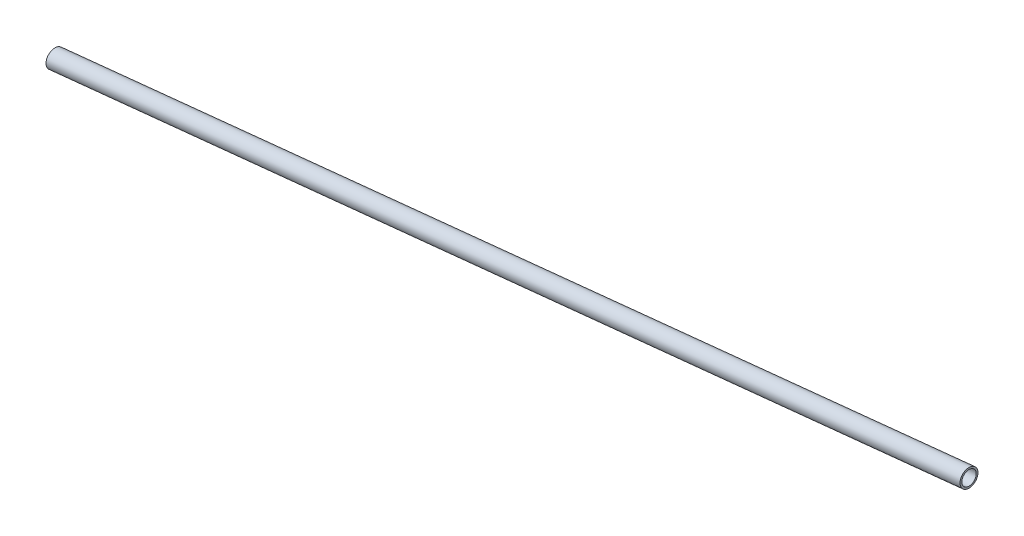
ISO-10303-21;
HEADER;
FILE_DESCRIPTION(('STEP AP214'),'2;1');
FILE_NAME('part.step','',(''),(''),'','','');
FILE_SCHEMA(('AUTOMOTIVE_DESIGN { 1 0 10303 214 1 1 1 1 }'));
ENDSEC;
DATA;
#1=APPLICATION_CONTEXT('core data for automotive mechanical design processes');
#2=APPLICATION_PROTOCOL_DEFINITION('international standard','automotive_design',2000,#1);
#3=PRODUCT_CONTEXT('',#1,'mechanical');
#4=PRODUCT('Part','Part','',(#3));
#5=PRODUCT_RELATED_PRODUCT_CATEGORY('part','',(#4));
#6=PRODUCT_DEFINITION_FORMATION('','',#4);
#7=PRODUCT_DEFINITION_CONTEXT('part definition',#1,'design');
#8=PRODUCT_DEFINITION('design','',#6,#7);
#9=PRODUCT_DEFINITION_SHAPE('','',#8);
#10=(LENGTH_UNIT() NAMED_UNIT(*) SI_UNIT(.MILLI.,.METRE.));
#11=(NAMED_UNIT(*) PLANE_ANGLE_UNIT() SI_UNIT($,.RADIAN.));
#12=(NAMED_UNIT(*) SI_UNIT($,.STERADIAN.) SOLID_ANGLE_UNIT());
#13=UNCERTAINTY_MEASURE_WITH_UNIT(LENGTH_MEASURE(1.E-05),#10,'distance_accuracy_value','');
#14=(GEOMETRIC_REPRESENTATION_CONTEXT(3) GLOBAL_UNCERTAINTY_ASSIGNED_CONTEXT((#13)) GLOBAL_UNIT_ASSIGNED_CONTEXT((#10,
#11,#12)) REPRESENTATION_CONTEXT('',''));
#15=CARTESIAN_POINT('',(0.,0.,0.));
#16=DIRECTION('',(0.,0.,1.));
#17=DIRECTION('',(1.,0.,0.));
#18=AXIS2_PLACEMENT_3D('',#15,#16,#17);
#19=CARTESIAN_POINT('',(900.,-13.3527483768346,-117.528566468452));
#20=DIRECTION('',(1.,0.,0.));
#21=DIRECTION('',(0.,0.,-1.));
#22=AXIS2_PLACEMENT_3D('',#19,#20,#21);
#23=PLANE('',#22);
#24=CARTESIAN_POINT('',(900.,-13.3527483768346,-117.528566468452));
#25=DIRECTION('',(1.,0.,0.));
#26=DIRECTION('',(0.,0.,-1.));
#27=AXIS2_PLACEMENT_3D('',#24,#25,#26);
#28=CIRCLE('',#27,7.99999999999999);
#29=CARTESIAN_POINT('',(900.,-13.6611981228931,-125.522617929017));
#30=VERTEX_POINT('',#29);
#31=EDGE_CURVE('E76',#30,#30,#28,.T.);
#32=ORIENTED_EDGE('',*,*,#31,.F.);
#33=EDGE_LOOP('',(#32));
#34=FACE_BOUND('',#33,.T.);
#35=CARTESIAN_POINT('',(900.,-13.3527483768346,-117.528566468452));
#36=DIRECTION('',(1.,0.,0.));
#37=DIRECTION('',(0.,0.,-1.));
#38=AXIS2_PLACEMENT_3D('',#35,#36,#37);
#39=CIRCLE('',#38,9.99999999999999);
#40=CARTESIAN_POINT('',(900.,-13.3527483768346,-127.528566468452));
#41=VERTEX_POINT('',#40);
#42=EDGE_CURVE('E11',#41,#41,#39,.T.);
#43=ORIENTED_EDGE('',*,*,#42,.T.);
#44=EDGE_LOOP('',(#43));
#45=FACE_BOUND('',#44,.T.);
#46=ADVANCED_FACE('F61',(#34,#45),#23,.T.);
#47=CARTESIAN_POINT('',(0.,0.,0.));
#48=DIRECTION('',(1.,0.,0.));
#49=DIRECTION('',(0.,0.,-1.));
#50=AXIS2_PLACEMENT_3D('',#47,#48,#49);
#51=PLANE('',#50);
#52=CARTESIAN_POINT('',(0.,0.,0.));
#53=DIRECTION('',(-1.,0.,0.));
#54=DIRECTION('',(0.,0.,1.));
#55=AXIS2_PLACEMENT_3D('',#52,#53,#54);
#56=CIRCLE('',#55,8.);
#57=CARTESIAN_POINT('',(0.,0.04684620258965,-7.9998628384056));
#58=VERTEX_POINT('',#57);
#59=EDGE_CURVE('E88',#58,#58,#56,.T.);
#60=ORIENTED_EDGE('',*,*,#59,.F.);
#61=EDGE_LOOP('',(#60));
#62=FACE_BOUND('',#61,.T.);
#63=CARTESIAN_POINT('',(0.,0.,0.));
#64=DIRECTION('',(1.,0.,0.));
#65=DIRECTION('',(0.,0.,-1.));
#66=AXIS2_PLACEMENT_3D('',#63,#64,#65);
#67=CIRCLE('',#66,10.);
#68=CARTESIAN_POINT('',(0.,0.,-10.));
#69=VERTEX_POINT('',#68);
#70=EDGE_CURVE('E70',#69,#69,#67,.T.);
#71=ORIENTED_EDGE('',*,*,#70,.F.);
#72=EDGE_LOOP('',(#71));
#73=FACE_BOUND('',#72,.T.);
#74=ADVANCED_FACE('F93',(#62,#73),#51,.F.);
#75=CARTESIAN_POINT('',(0.,0.,-10.));
#76=CARTESIAN_POINT('',(900.,-13.3527483768346,-127.528566468452));
#77=CARTESIAN_POINT('',(0.,0.416666666666666,-10.));
#78=CARTESIAN_POINT('',(900.,-12.9360817101679,-127.528566468452));
#79=CARTESIAN_POINT('',(0.,0.859634009449971,-9.97415615944867));
#80=CARTESIAN_POINT('',(900.,-12.4931143673846,-127.502722627901));
#81=CARTESIAN_POINT('',(0.,1.7952332471872,-9.84885269010886));
#82=CARTESIAN_POINT('',(900.,-11.5575151296474,-127.377419158561));
#83=CARTESIAN_POINT('',(0.,2.288,-9.74933333333333));
#84=CARTESIAN_POINT('',(900.000000000001,-11.0647483768346,-127.277899801786));
#85=CARTESIAN_POINT('',(0.,3.312,-9.45066666666667));
#86=CARTESIAN_POINT('',(900.,-10.0407483768346,-126.979233135119));
#87=CARTESIAN_POINT('',(0.,3.84336994487228,-9.25135715187476));
#88=CARTESIAN_POINT('',(900.,-9.5093784319623,-126.779923620327));
#89=CARTESIAN_POINT('',(0.,4.92067499894794,-8.72617093801288));
#90=CARTESIAN_POINT('',(900.,-8.43207337788663,-126.254737406465));
#91=CARTESIAN_POINT('',(0.,5.46666666666667,-8.4));
#92=CARTESIAN_POINT('',(900.,-7.88608171016791,-125.928566468452));
#93=CARTESIAN_POINT('',(0.,6.53333333333333,-7.6));
#94=CARTESIAN_POINT('',(900.,-6.81941504350124,-125.128566468452));
#95=CARTESIAN_POINT('',(0.,7.05385625820979,-7.12578970413461));
#96=CARTESIAN_POINT('',(900.,-6.29889211862478,-124.654356172587));
#97=CARTESIAN_POINT('',(0.,8.01463689247513,-6.02489522737224));
#98=CARTESIAN_POINT('',(900.,-5.33811148435944,-123.553461695825));
#99=CARTESIAN_POINT('',(0.,8.45444059976932,-5.39792387543253));
#100=CARTESIAN_POINT('',(900.,-4.89830777706526,-122.926490343885));
#101=CARTESIAN_POINT('',(0.,9.19261822376009,-4.01384083044983));
#102=CARTESIAN_POINT('',(900.,-4.16013015307449,-121.542407298902));
#103=CARTESIAN_POINT('',(0.,9.49033530571992,-3.25680473372781));
#104=CARTESIAN_POINT('',(900.,-3.86241307111466,-120.78537120218));
#105=CARTESIAN_POINT('',(0.,9.89428007889546,-1.66627218934911));
#106=CARTESIAN_POINT('',(900.,-3.45846829793912,-119.194838657801));
#107=CARTESIAN_POINT('',(0.,10.,-0.833333333333337));
#108=CARTESIAN_POINT('',(900.,-3.35274837683458,-118.361899801786));
#109=CARTESIAN_POINT('',(0.,9.99999999999999,0.833333333333334));
#110=CARTESIAN_POINT('',(900.,-3.35274837683458,-116.695233135119));
#111=CARTESIAN_POINT('',(0.,9.89428007889547,1.66627218934911));
#112=CARTESIAN_POINT('',(900.,-3.45846829793911,-115.862294279103));
#113=CARTESIAN_POINT('',(0.,9.49033530571992,3.25680473372781));
#114=CARTESIAN_POINT('',(900.,-3.86241307111466,-114.271761734725));
#115=CARTESIAN_POINT('',(0.,9.19261822376009,4.01384083044983));
#116=CARTESIAN_POINT('',(900.,-4.16013015307449,-113.514725638003));
#117=CARTESIAN_POINT('',(0.,8.45444059976932,5.39792387543252));
#118=CARTESIAN_POINT('',(900.,-4.89830777706526,-112.13064259302));
#119=CARTESIAN_POINT('',(0.,8.01463689247513,6.02489522737224));
#120=CARTESIAN_POINT('',(900.,-5.33811148435944,-111.50367124108));
#121=CARTESIAN_POINT('',(0.,7.0538562582098,7.12578970413461));
#122=CARTESIAN_POINT('',(900.,-6.29889211862478,-110.402776764318));
#123=CARTESIAN_POINT('',(0.,6.53333333333334,7.6));
#124=CARTESIAN_POINT('',(900.,-6.81941504350124,-109.928566468452));
#125=CARTESIAN_POINT('',(0.,5.46666666666667,8.4));
#126=CARTESIAN_POINT('',(900.,-7.88608171016791,-109.128566468452));
#127=CARTESIAN_POINT('',(0.,4.92067499894794,8.72617093801288));
#128=CARTESIAN_POINT('',(900.,-8.43207337788663,-108.802395530439));
#129=CARTESIAN_POINT('',(0.,3.84336994487228,9.25135715187476));
#130=CARTESIAN_POINT('',(900.,-9.50937843196229,-108.277209316578));
#131=CARTESIAN_POINT('',(0.,3.312,9.45066666666667));
#132=CARTESIAN_POINT('',(900.,-10.0407483768346,-108.077899801786));
#133=CARTESIAN_POINT('',(0.,2.288,9.74933333333334));
#134=CARTESIAN_POINT('',(900.,-11.0647483768346,-107.779233135119));
#135=CARTESIAN_POINT('',(0.,1.7952332471872,9.84885269010886));
#136=CARTESIAN_POINT('',(900.,-11.5575151296474,-107.679713778343));
#137=CARTESIAN_POINT('',(0.,0.859634009449971,9.97415615944867));
#138=CARTESIAN_POINT('',(900.,-12.4931143673846,-107.554410309004));
#139=CARTESIAN_POINT('',(0.,0.416666666666668,10.));
#140=CARTESIAN_POINT('',(900.,-12.9360817101679,-107.528566468452));
#141=CARTESIAN_POINT('',(0.,-0.416666666666665,10.));
#142=CARTESIAN_POINT('',(900.000000000001,-13.7694150435012,-107.528566468452));
#143=CARTESIAN_POINT('',(0.,-0.859634009449969,9.97415615944867));
#144=CARTESIAN_POINT('',(900.,-14.2123823862845,-107.554410309004));
#145=CARTESIAN_POINT('',(0.,-1.7952332471872,9.84885269010886));
#146=CARTESIAN_POINT('',(900.,-15.1479816240218,-107.679713778343));
#147=CARTESIAN_POINT('',(0.,-2.288,9.74933333333334));
#148=CARTESIAN_POINT('',(900.,-15.6407483768346,-107.779233135119));
#149=CARTESIAN_POINT('',(0.,-3.312,9.45066666666667));
#150=CARTESIAN_POINT('',(900.,-16.6647483768346,-108.077899801786));
#151=CARTESIAN_POINT('',(0.,-3.84336994487228,9.25135715187477));
#152=CARTESIAN_POINT('',(900.,-17.1961183217068,-108.277209316578));
#153=CARTESIAN_POINT('',(0.,-4.92067499894794,8.72617093801288));
#154=CARTESIAN_POINT('',(900.,-18.2734233757825,-108.802395530439));
#155=CARTESIAN_POINT('',(0.,-5.46666666666667,8.4));
#156=CARTESIAN_POINT('',(900.,-18.8194150435012,-109.128566468452));
#157=CARTESIAN_POINT('',(0.,-6.53333333333333,7.6));
#158=CARTESIAN_POINT('',(900.,-19.8860817101679,-109.928566468452));
#159=CARTESIAN_POINT('',(0.,-7.05385625820979,7.12578970413462));
#160=CARTESIAN_POINT('',(900.,-20.4066046350444,-110.402776764318));
#161=CARTESIAN_POINT('',(0.,-8.01463689247514,6.02489522737224));
#162=CARTESIAN_POINT('',(900.,-21.3673852693097,-111.50367124108));
#163=CARTESIAN_POINT('',(0.,-8.45444059976932,5.39792387543253));
#164=CARTESIAN_POINT('',(900.,-21.8071889766039,-112.13064259302));
#165=CARTESIAN_POINT('',(0.,-9.19261822376009,4.01384083044983));
#166=CARTESIAN_POINT('',(900.,-22.5453666005947,-113.514725638002));
#167=CARTESIAN_POINT('',(0.,-9.49033530571992,3.25680473372781));
#168=CARTESIAN_POINT('',(900.,-22.8430836825545,-114.271761734724));
#169=CARTESIAN_POINT('',(0.,-9.89428007889546,1.66627218934911));
#170=CARTESIAN_POINT('',(900.,-23.24702845573,-115.862294279103));
#171=CARTESIAN_POINT('',(0.,-10.,0.833333333333333));
#172=CARTESIAN_POINT('',(900.,-23.3527483768346,-116.695233135119));
#173=CARTESIAN_POINT('',(0.,-10.,-0.833333333333334));
#174=CARTESIAN_POINT('',(900.,-23.3527483768346,-118.361899801786));
#175=CARTESIAN_POINT('',(0.,-9.89428007889547,-1.66627218934911));
#176=CARTESIAN_POINT('',(900.,-23.24702845573,-119.194838657801));
#177=CARTESIAN_POINT('',(0.,-9.49033530571992,-3.25680473372781));
#178=CARTESIAN_POINT('',(900.,-22.8430836825545,-120.78537120218));
#179=CARTESIAN_POINT('',(0.,-9.19261822376009,-4.01384083044983));
#180=CARTESIAN_POINT('',(900.,-22.5453666005947,-121.542407298902));
#181=CARTESIAN_POINT('',(0.,-8.45444059976932,-5.39792387543252));
#182=CARTESIAN_POINT('',(900.,-21.8071889766039,-122.926490343885));
#183=CARTESIAN_POINT('',(0.,-8.01463689247514,-6.02489522737224));
#184=CARTESIAN_POINT('',(900.,-21.3673852693097,-123.553461695825));
#185=CARTESIAN_POINT('',(0.,-7.05385625820979,-7.12578970413461));
#186=CARTESIAN_POINT('',(900.,-20.4066046350444,-124.654356172587));
#187=CARTESIAN_POINT('',(0.,-6.53333333333333,-7.6));
#188=CARTESIAN_POINT('',(900.,-19.8860817101679,-125.128566468452));
#189=CARTESIAN_POINT('',(0.,-5.46666666666667,-8.4));
#190=CARTESIAN_POINT('',(900.,-18.8194150435012,-125.928566468452));
#191=CARTESIAN_POINT('',(0.,-4.92067499894794,-8.72617093801288));
#192=CARTESIAN_POINT('',(900.,-18.2734233757825,-126.254737406465));
#193=CARTESIAN_POINT('',(0.,-3.84336994487228,-9.25135715187476));
#194=CARTESIAN_POINT('',(900.,-17.1961183217069,-126.779923620327));
#195=CARTESIAN_POINT('',(0.,-3.312,-9.45066666666666));
#196=CARTESIAN_POINT('',(900.000000000001,-16.6647483768346,-126.979233135119));
#197=CARTESIAN_POINT('',(0.,-2.288,-9.74933333333334));
#198=CARTESIAN_POINT('',(900.,-15.6407483768346,-127.277899801786));
#199=CARTESIAN_POINT('',(0.,-1.7952332471872,-9.84885269010886));
#200=CARTESIAN_POINT('',(900.,-15.1479816240218,-127.377419158561));
#201=CARTESIAN_POINT('',(0.,-0.85963400944997,-9.97415615944867));
#202=CARTESIAN_POINT('',(900.,-14.2123823862845,-127.502722627901));
#203=CARTESIAN_POINT('',(0.,-0.416666666666666,-10.));
#204=CARTESIAN_POINT('',(900.,-13.7694150435012,-127.528566468452));
#205=CARTESIAN_POINT('',(0.,0.,-10.));
#206=CARTESIAN_POINT('',(900.,-13.3527483768346,-127.528566468452));
#207=B_SPLINE_SURFACE_WITH_KNOTS('',3,1,((#75,#76),(#77,#78),(#79,#80),(#81,#82),(#83,#84),(#85,
#86),(#87,#88),(#89,#90),(#91,#92),(#93,#94),(#95,#96),(#97,#98),(#99,#100),(#101,#102),(#103,
#104),(#105,#106),(#107,#108),(#109,#110),(#111,#112),(#113,#114),(#115,#116),(#117,#118),(#119,
#120),(#121,#122),(#123,#124),(#125,#126),(#127,#128),(#129,#130),(#131,#132),(#133,#134),(#135,
#136),(#137,#138),(#139,#140),(#141,#142),(#143,#144),(#145,#146),(#147,#148),(#149,#150),(#151,
#152),(#153,#154),(#155,#156),(#157,#158),(#159,#160),(#161,#162),(#163,#164),(#165,#166),(#167,
#168),(#169,#170),(#171,#172),(#173,#174),(#175,#176),(#177,#178),(#179,#180),(#181,#182),(#183,
#184),(#185,#186),(#187,#188),(#189,#190),(#191,#192),(#193,#194),(#195,#196),(#197,#198),(#199,
#200),(#201,#202),(#203,#204),(#205,#206)),.UNSPECIFIED.,.T.,.F.,.F.,(4,2,2,2,2,2,2,2,2,2,2,2,2,
2,2,2,2,2,2,2,2,2,2,2,2,2,2,2,2,2,2,2,4),(2,2),(0.,0.03125,0.0625,0.09375,0.125,0.15625,0.1875,
0.21875,0.25,0.28125,0.3125,0.34375,0.375,0.40625,0.4375,0.46875,0.5,0.53125,0.5625,0.59375,
0.625,0.65625,0.6875,0.71875,0.75,0.78125,0.8125,0.84375,0.875,0.90625,0.9375,0.96875,1.),(0.,
1.),.UNSPECIFIED.);
#208=CARTESIAN_POINT('',(0.,0.,-10.));
#209=CARTESIAN_POINT('',(9.375,-0.13909112892536,-11.224255900713));
#210=CARTESIAN_POINT('',(18.75,-0.27818225785072,-12.4485118014261));
#211=CARTESIAN_POINT('',(37.5,-0.556364515701441,-14.8970236028522));
#212=CARTESIAN_POINT('',(46.875,-0.695455644626801,-16.1212795035652));
#213=CARTESIAN_POINT('',(65.625,-0.973637902477521,-18.5697913049913));
#214=CARTESIAN_POINT('',(75.,-1.11272903140288,-19.7940472057044));
#215=CARTESIAN_POINT('',(93.75,-1.3909112892536,-22.2425590071305));
#216=CARTESIAN_POINT('',(103.125,-1.53000241817896,-23.4668149078435));
#217=CARTESIAN_POINT('',(121.875,-1.80818467602968,-25.9153267092696));
#218=CARTESIAN_POINT('',(131.25,-1.94727580495504,-27.1395826099826));
#219=CARTESIAN_POINT('',(150.,-2.22545806280576,-29.5880944114087));
#220=CARTESIAN_POINT('',(159.375,-2.36454919173112,-30.8123503121218));
#221=CARTESIAN_POINT('',(178.125,-2.64273144958184,-33.2608621135479));
#222=CARTESIAN_POINT('',(187.5,-2.7818225785072,-34.4851180142609));
#223=CARTESIAN_POINT('',(206.25,-3.06000483635792,-36.933629815687));
#224=CARTESIAN_POINT('',(215.625,-3.19909596528328,-38.1578857164));
#225=CARTESIAN_POINT('',(234.375,-3.477278223134,-40.6063975178261));
#226=CARTESIAN_POINT('',(243.75,-3.61636935205936,-41.8306534185392));
#227=CARTESIAN_POINT('',(262.5,-3.89455160991008,-44.2791652199653));
#228=CARTESIAN_POINT('',(271.875,-4.03364273883544,-45.5034211206783));
#229=CARTESIAN_POINT('',(290.625,-4.31182499668616,-47.9519329221044));
#230=CARTESIAN_POINT('',(300.,-4.45091612561152,-49.1761888228174));
#231=CARTESIAN_POINT('',(318.75,-4.72909838346224,-51.6247006242435));
#232=CARTESIAN_POINT('',(328.125,-4.8681895123876,-52.8489565249566));
#233=CARTESIAN_POINT('',(346.875,-5.14637177023832,-55.2974683263827));
#234=CARTESIAN_POINT('',(356.25,-5.28546289916368,-56.5217242270957));
#235=CARTESIAN_POINT('',(375.,-5.56364515701441,-58.9702360285218));
#236=CARTESIAN_POINT('',(384.375,-5.70273628593977,-60.1944919292348));
#237=CARTESIAN_POINT('',(403.125,-5.98091854379049,-62.6430037306609));
#238=CARTESIAN_POINT('',(412.5,-6.12000967271585,-63.867259631374));
#239=CARTESIAN_POINT('',(431.25,-6.39819193056657,-66.3157714328001));
#240=CARTESIAN_POINT('',(440.625,-6.53728305949193,-67.5400273335131));
#241=CARTESIAN_POINT('',(459.375,-6.81546531734265,-69.9885391349392));
#242=CARTESIAN_POINT('',(468.75,-6.95455644626801,-71.2127950356522));
#243=CARTESIAN_POINT('',(487.5,-7.23273870411873,-73.6613068370783));
#244=CARTESIAN_POINT('',(496.875,-7.37182983304409,-74.8855627377914));
#245=CARTESIAN_POINT('',(515.625,-7.65001209089481,-77.3340745392175));
#246=CARTESIAN_POINT('',(525.,-7.78910321982017,-78.5583304399305));
#247=CARTESIAN_POINT('',(543.75,-8.06728547767089,-81.0068422413566));
#248=CARTESIAN_POINT('',(553.125,-8.20637660659625,-82.2310981420697));
#249=CARTESIAN_POINT('',(571.875,-8.48455886444697,-84.6796099434958));
#250=CARTESIAN_POINT('',(581.25,-8.62364999337233,-85.9038658442088));
#251=CARTESIAN_POINT('',(600.,-8.90183225122305,-88.3523776456349));
#252=CARTESIAN_POINT('',(609.375,-9.04092338014841,-89.5766335463479));
#253=CARTESIAN_POINT('',(628.125,-9.31910563799913,-92.025145347774));
#254=CARTESIAN_POINT('',(637.5,-9.45819676692449,-93.2494012484871));
#255=CARTESIAN_POINT('',(656.25,-9.73637902477521,-95.6979130499132));
#256=CARTESIAN_POINT('',(665.625,-9.87547015370057,-96.9221689506262));
#257=CARTESIAN_POINT('',(684.375,-10.1536524115513,-99.3706807520523));
#258=CARTESIAN_POINT('',(693.75,-10.2927435404767,-100.594936652765));
#259=CARTESIAN_POINT('',(712.5,-10.5709257983274,-103.043448454191));
#260=CARTESIAN_POINT('',(721.875,-10.7100169272527,-104.267704354904));
#261=CARTESIAN_POINT('',(740.625,-10.9881991851034,-106.716216156331));
#262=CARTESIAN_POINT('',(750.,-11.1272903140288,-107.940472057044));
#263=CARTESIAN_POINT('',(768.75,-11.4054725718795,-110.38898385847));
#264=CARTESIAN_POINT('',(778.125,-11.5445637008049,-111.613239759183));
#265=CARTESIAN_POINT('',(796.875,-11.8227459586556,-114.061751560609));
#266=CARTESIAN_POINT('',(806.25,-11.961837087581,-115.286007461322));
#267=CARTESIAN_POINT('',(825.,-12.2400193454317,-117.734519262748));
#268=CARTESIAN_POINT('',(834.375,-12.3791104743571,-118.958775163461));
#269=CARTESIAN_POINT('',(853.125,-12.6572927322078,-121.407286964887));
#270=CARTESIAN_POINT('',(862.5,-12.7963838611331,-122.6315428656));
#271=CARTESIAN_POINT('',(881.25,-13.0745661189839,-125.080054667026));
#272=CARTESIAN_POINT('',(890.625,-13.2136572479092,-126.304310567739));
#273=CARTESIAN_POINT('',(900.,-13.3527483768346,-127.528566468452));
#274=B_SPLINE_CURVE_WITH_KNOTS('',3,(#208,#209,#210,#211,#212,#213,#214,#215,#216,#217,#218,
#219,#220,#221,#222,#223,#224,#225,#226,#227,#228,#229,#230,#231,#232,#233,#234,#235,#236,#237,
#238,#239,#240,#241,#242,#243,#244,#245,#246,#247,#248,#249,#250,#251,#252,#253,#254,#255,#256,
#257,#258,#259,#260,#261,#262,#263,#264,#265,#266,#267,#268,#269,#270,#271,#272,#273),
.UNSPECIFIED.,.F.,.F.,(4,2,2,2,2,2,2,2,2,2,2,2,2,2,2,2,2,2,2,2,2,2,2,2,2,2,2,2,2,2,2,2,4),(0.,
28.3668638498017,56.7337276996035,85.1005915494052,113.467455399207,141.834319249009,
170.20118309881,198.568046948612,226.934910798414,255.301774648216,283.668638498017,
312.035502347819,340.402366197621,368.769230047423,397.136093897224,425.502957747026,
453.869821596828,482.23668544663,510.603549296431,538.970413146233,567.337276996035,
595.704140845837,624.071004695638,652.43786854544,680.804732395242,709.171596245043,
737.538460094845,765.905323944647,794.272187794449,822.63905164425,851.005915494052,
879.372779343854,907.739643193656),.UNSPECIFIED.);
#275=EDGE_CURVE('BSEAM102',#69,#41,#274,.T.);
#276=ORIENTED_EDGE('',*,*,#70,.T.);
#277=ORIENTED_EDGE('',*,*,#42,.F.);
#278=ORIENTED_EDGE('',*,*,#275,.T.);
#279=ORIENTED_EDGE('',*,*,#275,.F.);
#280=EDGE_LOOP('',(#276,#278,#277,#279));
#281=FACE_BOUND('',#280,.T.);
#282=ADVANCED_FACE('F102',(#281),#207,.T.);
#283=CARTESIAN_POINT('',(0.,0.04684620258965,-7.9998628384056));
#284=CARTESIAN_POINT('',(900.,-13.6611981228931,-125.522617929017));
#285=CARTESIAN_POINT('',(0.,0.71350143912345,-7.9959589881898));
#286=CARTESIAN_POINT('',(900.,-12.9950271678461,-125.548322074522));
#287=CARTESIAN_POINT('',(0.,1.46714713450424,-7.91047767606317));
#288=CARTESIAN_POINT('',(900.,-12.2383289594035,-125.496392215783));
#289=CARTESIAN_POINT('',(0.,2.69382735660733,-7.54488824418483));
#290=CARTESIAN_POINT('',(900.,-10.9966241064373,-125.185636591345));
#291=CARTESIAN_POINT('',(0.,3.11798233475947,-7.38295409970364));
#292=CARTESIAN_POINT('',(900.,-10.5656965411242,-125.042697632018));
#293=CARTESIAN_POINT('',(0.,3.97735130355492,-6.95776556707056));
#294=CARTESIAN_POINT('',(900.,-9.68829398159356,-124.656090517054));
#295=CARTESIAN_POINT('',(0.,4.41260916183703,-6.69427552684503));
#296=CARTESIAN_POINT('',(900.,-9.24176469841509,-124.412188889839));
#297=CARTESIAN_POINT('',(0.,5.26218016839313,-6.04928957149636));
#298=CARTESIAN_POINT('',(900.,-8.36438989627017,-123.80556607924));
#299=CARTESIAN_POINT('',(0.,5.67636987355985,-5.66748938690894));
#300=CARTESIAN_POINT('',(900.,-7.93365418694976,-123.442535444812));
#301=CARTESIAN_POINT('',(0.,6.43982393018292,-4.78228801311951));
#302=CARTESIAN_POINT('',(900.,-7.13164414150718,-122.592109989088));
#303=CARTESIAN_POINT('',(0.,6.78872374090341,-4.27865921784961));
#304=CARTESIAN_POINT('',(900.,-6.76072387921232,-122.104471598101));
#305=CARTESIAN_POINT('',(0.,7.37277181166143,-3.16795368431511));
#306=CARTESIAN_POINT('',(900.,-6.12792888151547,-121.020797559439));
#307=CARTESIAN_POINT('',(0.,7.60739496705886,-2.56094049909171));
#308=CARTESIAN_POINT('',(900.,-5.86658155494876,-120.424802083801));
#309=CARTESIAN_POINT('',(0.,7.92309420404844,-1.2866439517188));
#310=CARTESIAN_POINT('',(900.,-5.49460608860847,-119.165781849126));
#311=CARTESIAN_POINT('',(0.,8.00376668862141,-0.619809033944151));
#312=CARTESIAN_POINT('',(900.000000000001,-5.38440106177478,-118.503187169558));
#313=CARTESIAN_POINT('',(0.,7.99595898818979,0.71350143912345));
#314=CARTESIAN_POINT('',(900.,-5.33299277076502,-117.170845259464));
#315=CARTESIAN_POINT('',(0.,7.90748249913809,1.37934584152974));
#316=CARTESIAN_POINT('',(900.,-5.39181384187463,-116.501728723333));
#317=CARTESIAN_POINT('',(0.,7.57688118018863,2.6498577331668));
#318=CARTESIAN_POINT('',(900.,-5.66566943633262,-115.217789156115));
#319=CARTESIAN_POINT('',(0.,7.33516517152026,3.25408153544302));
#320=CARTESIAN_POINT('',(900.,-5.88031524454111,-114.603427528812));
#321=CARTESIAN_POINT('',(0.,6.73814929381701,4.3578709052734));
#322=CARTESIAN_POINT('',(900.,-6.42772622948818,-113.474215350017));
#323=CARTESIAN_POINT('',(0.,6.38337523770235,4.85737907382898));
#324=CARTESIAN_POINT('',(900.,-6.75996866092469,-112.959445490663));
#325=CARTESIAN_POINT('',(0.,5.60960663594162,5.73357866277101));
#326=CARTESIAN_POINT('',(900.,-7.49406458200833,-112.049749526409));
#327=CARTESIAN_POINT('',(0.,5.19097394045686,6.11050194288017));
#328=CARTESIAN_POINT('',(900.,-7.89554628226114,-111.654607859181));
#329=CARTESIAN_POINT('',(0.,4.33390754148642,6.74549404167638));
#330=CARTESIAN_POINT('',(900.,-8.72356912503668,-110.98218243609));
#331=CARTESIAN_POINT('',(0.,3.89559370923611,7.00386855464627));
#332=CARTESIAN_POINT('',(900.,-9.1499769396148,-110.704598610623));
#333=CARTESIAN_POINT('',(0.,3.03130414448628,7.41896355711653));
#334=CARTESIAN_POINT('',(900.,-9.99498078828562,-110.251532601588));
#335=CARTESIAN_POINT('',(0.,2.60528178755254,7.57591916878022));
#336=CARTESIAN_POINT('',(900.,-10.4136129597538,-110.075813457349));
#337=CARTESIAN_POINT('',(0.,1.37440414569743,7.92711744722302));
#338=CARTESIAN_POINT('',(900.,-11.6276807154731,-109.670302070921));
#339=CARTESIAN_POINT('',(0.,0.619809033944149,8.00376668862141));
#340=CARTESIAN_POINT('',(900.,-12.3781276757289,-109.560219153392));
#341=CARTESIAN_POINT('',(0.,-0.713501439123451,7.9959589881898));
#342=CARTESIAN_POINT('',(900.,-13.7104695858231,-109.508810862383));
#343=CARTESIAN_POINT('',(0.,-1.46714713450424,7.91047767606317));
#344=CARTESIAN_POINT('',(900.,-14.4671677942657,-109.560740721121));
#345=CARTESIAN_POINT('',(0.,-2.69382735660733,7.54488824418483));
#346=CARTESIAN_POINT('',(900.,-15.7088726472318,-109.87149634556));
#347=CARTESIAN_POINT('',(0.,-3.11798233475947,7.38295409970363));
#348=CARTESIAN_POINT('',(900.,-16.1398002125449,-110.014435304887));
#349=CARTESIAN_POINT('',(0.,-3.97735130355492,6.95776556707056));
#350=CARTESIAN_POINT('',(900.,-17.0172027720756,-110.40104241985));
#351=CARTESIAN_POINT('',(0.,-4.41260916183704,6.69427552684504));
#352=CARTESIAN_POINT('',(900.,-17.4637320552541,-110.644944047066));
#353=CARTESIAN_POINT('',(0.,-5.26218016839313,6.04928957149635));
#354=CARTESIAN_POINT('',(900.,-18.341106857399,-111.251566857665));
#355=CARTESIAN_POINT('',(0.,-5.67636987355985,5.66748938690893));
#356=CARTESIAN_POINT('',(900.000000000001,-18.7718425667194,-111.614597492093));
#357=CARTESIAN_POINT('',(0.,-6.43982393018293,4.78228801311951));
#358=CARTESIAN_POINT('',(900.000000000001,-19.573852612162,-112.465022947816));
#359=CARTESIAN_POINT('',(0.,-6.78872374090342,4.27865921784961));
#360=CARTESIAN_POINT('',(900.000000000001,-19.9447728744568,-112.952661338804));
#361=CARTESIAN_POINT('',(0.,-7.37277181166143,3.16795368431511));
#362=CARTESIAN_POINT('',(900.000000000001,-20.5775678721537,-114.036335377466));
#363=CARTESIAN_POINT('',(0.,-7.60739496705886,2.56094049909171));
#364=CARTESIAN_POINT('',(900.,-20.8389151987204,-114.632330853103));
#365=CARTESIAN_POINT('',(0.,-7.92309420404844,1.2866439517188));
#366=CARTESIAN_POINT('',(900.,-21.2108906650607,-115.891351087779));
#367=CARTESIAN_POINT('',(0.,-8.00376668862141,0.619809033944147));
#368=CARTESIAN_POINT('',(900.,-21.3210956918944,-116.553945767347));
#369=CARTESIAN_POINT('',(0.,-7.9959589881898,-0.71350143912345));
#370=CARTESIAN_POINT('',(900.000000000001,-21.3725039829041,-117.886287677441));
#371=CARTESIAN_POINT('',(0.,-7.90748249913809,-1.37934584152974));
#372=CARTESIAN_POINT('',(900.000000000001,-21.3136829117945,-118.555404213572));
#373=CARTESIAN_POINT('',(0.,-7.57688118018863,-2.6498577331668));
#374=CARTESIAN_POINT('',(900.000000000001,-21.0398273173365,-119.839343780789));
#375=CARTESIAN_POINT('',(0.,-7.33516517152026,-3.25408153544302));
#376=CARTESIAN_POINT('',(900.000000000001,-20.825181509128,-120.453705408092));
#377=CARTESIAN_POINT('',(0.,-6.73814929381701,-4.3578709052734));
#378=CARTESIAN_POINT('',(900.000000000001,-20.277770524181,-121.582917586888));
#379=CARTESIAN_POINT('',(0.,-6.38337523770235,-4.85737907382898));
#380=CARTESIAN_POINT('',(900.000000000001,-19.9455280927445,-122.097687446241));
#381=CARTESIAN_POINT('',(0.,-5.60960663594162,-5.73357866277101));
#382=CARTESIAN_POINT('',(900.,-19.2114321716608,-123.007383410496));
#383=CARTESIAN_POINT('',(0.,-5.19097394045686,-6.11050194288017));
#384=CARTESIAN_POINT('',(900.,-18.809950471408,-123.402525077723));
#385=CARTESIAN_POINT('',(0.,-4.33390754148642,-6.74549404167638));
#386=CARTESIAN_POINT('',(900.,-17.9819276286325,-124.074950500815));
#387=CARTESIAN_POINT('',(0.,-3.89559370923611,-7.00386855464627));
#388=CARTESIAN_POINT('',(900.,-17.5555198140543,-124.352534326282));
#389=CARTESIAN_POINT('',(0.,-3.03130414448628,-7.41896355711653));
#390=CARTESIAN_POINT('',(900.,-16.7105159653835,-124.805600335317));
#391=CARTESIAN_POINT('',(0.,-2.60528178755255,-7.57591916878021));
#392=CARTESIAN_POINT('',(900.,-16.2918837939154,-124.981319479555));
#393=CARTESIAN_POINT('',(0.,-1.37440414569742,-7.92711744722302));
#394=CARTESIAN_POINT('',(900.,-15.077816038196,-125.386830865983));
#395=CARTESIAN_POINT('',(0.,-0.619809033944146,-8.0037666886214));
#396=CARTESIAN_POINT('',(900.,-14.3273690779402,-125.496913783512));
#397=CARTESIAN_POINT('',(0.,0.04684620258965,-7.9998628384056));
#398=CARTESIAN_POINT('',(900.,-13.6611981228931,-125.522617929017));
#399=B_SPLINE_SURFACE_WITH_KNOTS('',3,1,((#283,#284),(#285,#286),(#287,#288),(#289,#290),(#291,
#292),(#293,#294),(#295,#296),(#297,#298),(#299,#300),(#301,#302),(#303,#304),(#305,#306),(#307,
#308),(#309,#310),(#311,#312),(#313,#314),(#315,#316),(#317,#318),(#319,#320),(#321,#322),(#323,
#324),(#325,#326),(#327,#328),(#329,#330),(#331,#332),(#333,#334),(#335,#336),(#337,#338),(#339,
#340),(#341,#342),(#343,#344),(#345,#346),(#347,#348),(#349,#350),(#351,#352),(#353,#354),(#355,
#356),(#357,#358),(#359,#360),(#361,#362),(#363,#364),(#365,#366),(#367,#368),(#369,#370),(#371,
#372),(#373,#374),(#375,#376),(#377,#378),(#379,#380),(#381,#382),(#383,#384),(#385,#386),(#387,
#388),(#389,#390),(#391,#392),(#393,#394),(#395,#396),(#397,#398)),.UNSPECIFIED.,.T.,.F.,.F.,(4,
2,2,2,2,2,2,2,2,2,2,2,2,2,2,2,2,2,2,2,2,2,2,2,2,2,2,2,4),(2,2),(0.,0.0625000000000002,
0.0937500000000002,0.125,0.15625,0.1875,0.21875,0.25,0.28125,0.312500000000001,
0.343750000000001,0.375000000000001,0.406250000000001,0.437500000000001,0.500000000000001,
0.562500000000001,0.593750000000001,0.625000000000001,0.65625,0.6875,0.71875,0.75,0.78125,
0.8125,0.84375,0.875,0.90625,0.9375,1.),(0.,1.),.UNSPECIFIED.);
#400=CARTESIAN_POINT('',(0.,0.04684620258965,-7.9998628384056));
#401=CARTESIAN_POINT('',(9.37499999999999,-0.095945925800796,-9.2240582039328));
#402=CARTESIAN_POINT('',(18.75,-0.238738054191242,-10.44825356946));
#403=CARTESIAN_POINT('',(37.5,-0.524322310972133,-12.8966443005144));
#404=CARTESIAN_POINT('',(46.875,-0.667114439362579,-14.1208396660416));
#405=CARTESIAN_POINT('',(65.625,-0.952698696143471,-16.569230397096));
#406=CARTESIAN_POINT('',(75.,-1.09549082453392,-17.7934257626232));
#407=CARTESIAN_POINT('',(93.75,-1.38107508131481,-20.2418164936776));
#408=CARTESIAN_POINT('',(103.125,-1.52386720970525,-21.4660118592048));
#409=CARTESIAN_POINT('',(121.875,-1.80945146648615,-23.9144025902592));
#410=CARTESIAN_POINT('',(131.25,-1.95224359487659,-25.1385979557864));
#411=CARTESIAN_POINT('',(150.,-2.23782785165748,-27.5869886868408));
#412=CARTESIAN_POINT('',(159.375,-2.38061998004793,-28.811184052368));
#413=CARTESIAN_POINT('',(178.125,-2.66620423682882,-31.2595747834224));
#414=CARTESIAN_POINT('',(187.5,-2.80899636521927,-32.4837701489496));
#415=CARTESIAN_POINT('',(206.25,-3.09458062200016,-34.9321608800041));
#416=CARTESIAN_POINT('',(215.625,-3.2373727503906,-36.1563562455313));
#417=CARTESIAN_POINT('',(234.375,-3.5229570071715,-38.6047469765857));
#418=CARTESIAN_POINT('',(243.75,-3.66574913556194,-39.8289423421129));
#419=CARTESIAN_POINT('',(262.5,-3.95133339234283,-42.2773330731673));
#420=CARTESIAN_POINT('',(271.875,-4.09412552073328,-43.5015284386945));
#421=CARTESIAN_POINT('',(290.625,-4.37970977751417,-45.9499191697489));
#422=CARTESIAN_POINT('',(300.,-4.52250190590461,-47.1741145352761));
#423=CARTESIAN_POINT('',(318.75,-4.80808616268551,-49.6225052663305));
#424=CARTESIAN_POINT('',(328.125,-4.95087829107595,-50.8467006318577));
#425=CARTESIAN_POINT('',(346.875,-5.23646254785684,-53.2950913629121));
#426=CARTESIAN_POINT('',(356.25,-5.37925467624729,-54.5192867284393));
#427=CARTESIAN_POINT('',(375.,-5.66483893302818,-56.9676774594937));
#428=CARTESIAN_POINT('',(384.375,-5.80763106141863,-58.1918728250209));
#429=CARTESIAN_POINT('',(403.125,-6.09321531819952,-60.6402635560753));
#430=CARTESIAN_POINT('',(412.5,-6.23600744658997,-61.8644589216025));
#431=CARTESIAN_POINT('',(431.25,-6.52159170337086,-64.3128496526569));
#432=CARTESIAN_POINT('',(440.625,-6.6643838317613,-65.5370450181841));
#433=CARTESIAN_POINT('',(459.375,-6.94996808854219,-67.9854357492385));
#434=CARTESIAN_POINT('',(468.75,-7.09276021693264,-69.2096311147657));
#435=CARTESIAN_POINT('',(487.5,-7.37834447371353,-71.6580218458201));
#436=CARTESIAN_POINT('',(496.875,-7.52113660210398,-72.8822172113473));
#437=CARTESIAN_POINT('',(515.625,-7.80672085888487,-75.3306079424017));
#438=CARTESIAN_POINT('',(525.,-7.94951298727532,-76.5548033079289));
#439=CARTESIAN_POINT('',(543.75,-8.23509724405621,-79.0031940389833));
#440=CARTESIAN_POINT('',(553.125,-8.37788937244665,-80.2273894045105));
#441=CARTESIAN_POINT('',(571.875,-8.66347362922754,-82.6757801355649));
#442=CARTESIAN_POINT('',(581.25,-8.80626575761799,-83.8999755010922));
#443=CARTESIAN_POINT('',(600.,-9.09185001439888,-86.3483662321466));
#444=CARTESIAN_POINT('',(609.375,-9.23464214278933,-87.5725615976738));
#445=CARTESIAN_POINT('',(628.125,-9.52022639957022,-90.0209523287282));
#446=CARTESIAN_POINT('',(637.5,-9.66301852796066,-91.2451476942554));
#447=CARTESIAN_POINT('',(656.25,-9.94860278474156,-93.6935384253098));
#448=CARTESIAN_POINT('',(665.625,-10.091394913132,-94.917733790837));
#449=CARTESIAN_POINT('',(684.375,-10.3769791699129,-97.3661245218914));
#450=CARTESIAN_POINT('',(693.75,-10.5197712983033,-98.5903198874186));
#451=CARTESIAN_POINT('',(712.5,-10.8053555550842,-101.038710618473));
#452=CARTESIAN_POINT('',(721.875,-10.9481476834747,-102.262905984));
#453=CARTESIAN_POINT('',(740.625,-11.2337319402556,-104.711296715055));
#454=CARTESIAN_POINT('',(750.,-11.376524068646,-105.935492080582));
#455=CARTESIAN_POINT('',(768.75,-11.6621083254269,-108.383882811636));
#456=CARTESIAN_POINT('',(778.125,-11.8049004538174,-109.608078177163));
#457=CARTESIAN_POINT('',(796.875,-12.0904847105982,-112.056468908218));
#458=CARTESIAN_POINT('',(806.25,-12.2332768389887,-113.280664273745));
#459=CARTESIAN_POINT('',(825.,-12.5188610957696,-115.729055004799));
#460=CARTESIAN_POINT('',(834.375,-12.66165322416,-116.953250370327));
#461=CARTESIAN_POINT('',(853.125,-12.9472374809409,-119.401641101381));
#462=CARTESIAN_POINT('',(862.5,-13.0900296093314,-120.625836466908));
#463=CARTESIAN_POINT('',(881.25,-13.3756138661123,-123.074227197963));
#464=CARTESIAN_POINT('',(890.625,-13.5184059945027,-124.29842256349));
#465=CARTESIAN_POINT('',(900.,-13.6611981228931,-125.522617929017));
#466=B_SPLINE_CURVE_WITH_KNOTS('',3,(#400,#401,#402,#403,#404,#405,#406,#407,#408,#409,#410,
#411,#412,#413,#414,#415,#416,#417,#418,#419,#420,#421,#422,#423,#424,#425,#426,#427,#428,#429,
#430,#431,#432,#433,#434,#435,#436,#437,#438,#439,#440,#441,#442,#443,#444,#445,#446,#447,#448,
#449,#450,#451,#452,#453,#454,#455,#456,#457,#458,#459,#460,#461,#462,#463,#464,#465),
.UNSPECIFIED.,.F.,.F.,(4,2,2,2,2,2,2,2,2,2,2,2,2,2,2,2,2,2,2,2,2,2,2,2,2,2,2,2,2,2,2,2,4),(0.,
28.367005833612,56.734011667224,85.101017500836,113.468023334448,141.83502916806,
170.202035001672,198.569040835284,226.936046668896,255.303052502508,283.67005833612,
312.037064169732,340.404070003344,368.771075836956,397.138081670568,425.50508750418,
453.872093337792,482.239099171404,510.606105005016,538.973110838628,567.34011667224,
595.707122505852,624.074128339464,652.441134173076,680.808140006688,709.1751458403,
737.542151673912,765.909157507524,794.276163341136,822.643169174748,851.01017500836,
879.377180841972,907.744186675584),.UNSPECIFIED.);
#467=EDGE_CURVE('BSEAM103',#58,#30,#466,.T.);
#468=ORIENTED_EDGE('',*,*,#59,.T.);
#469=ORIENTED_EDGE('',*,*,#31,.T.);
#470=ORIENTED_EDGE('',*,*,#467,.T.);
#471=ORIENTED_EDGE('',*,*,#467,.F.);
#472=EDGE_LOOP('',(#468,#470,#469,#471));
#473=FACE_BOUND('',#472,.T.);
#474=ADVANCED_FACE('F103',(#473),#399,.F.);
#475=CLOSED_SHELL('',(#46,#74,#282,#474));
#476=MANIFOLD_SOLID_BREP('B2',#475);
#477=ADVANCED_BREP_SHAPE_REPRESENTATION('',(#18,#476),#14);
#478=SHAPE_DEFINITION_REPRESENTATION(#9,#477);
ENDSEC;
END-ISO-10303-21;
